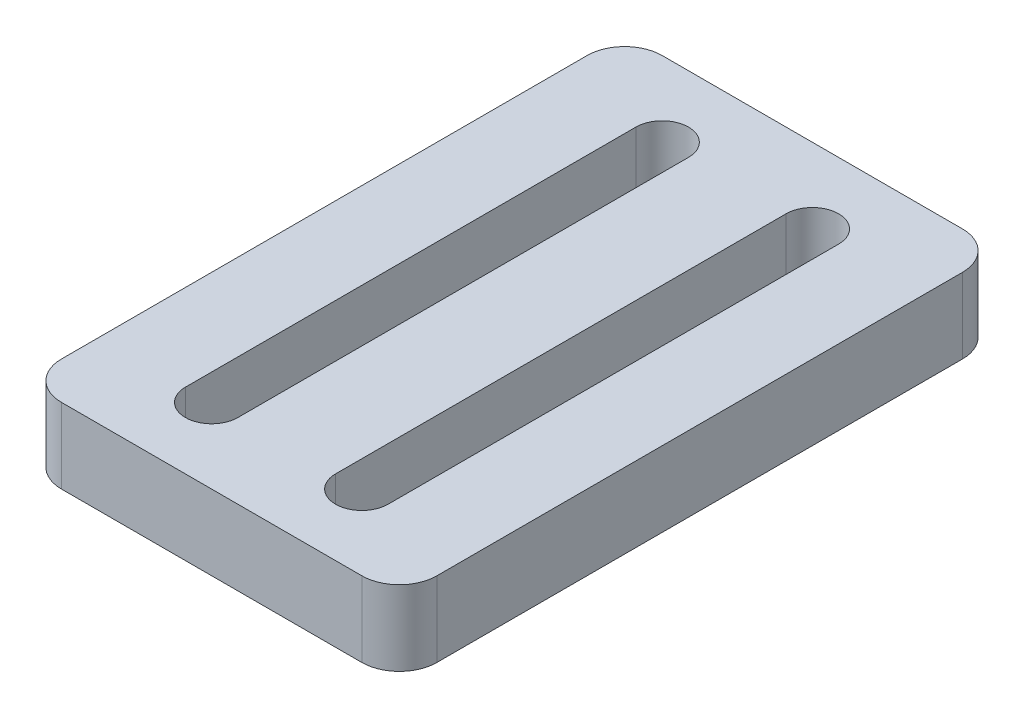
ISO-10303-21;
HEADER;
FILE_DESCRIPTION(('STEP AP214'),'2;1');
FILE_NAME('part.step','',(''),(''),'','','');
FILE_SCHEMA(('AUTOMOTIVE_DESIGN { 1 0 10303 214 1 1 1 1 }'));
ENDSEC;
DATA;
#1=APPLICATION_CONTEXT('core data for automotive mechanical design processes');
#2=APPLICATION_PROTOCOL_DEFINITION('international standard','automotive_design',2000,#1);
#3=PRODUCT_CONTEXT('',#1,'mechanical');
#4=PRODUCT('Part','Part','',(#3));
#5=PRODUCT_RELATED_PRODUCT_CATEGORY('part','',(#4));
#6=PRODUCT_DEFINITION_FORMATION('','',#4);
#7=PRODUCT_DEFINITION_CONTEXT('part definition',#1,'design');
#8=PRODUCT_DEFINITION('design','',#6,#7);
#9=PRODUCT_DEFINITION_SHAPE('','',#8);
#10=(LENGTH_UNIT() NAMED_UNIT(*) SI_UNIT(.MILLI.,.METRE.));
#11=(NAMED_UNIT(*) PLANE_ANGLE_UNIT() SI_UNIT($,.RADIAN.));
#12=(NAMED_UNIT(*) SI_UNIT($,.STERADIAN.) SOLID_ANGLE_UNIT());
#13=UNCERTAINTY_MEASURE_WITH_UNIT(LENGTH_MEASURE(1.E-05),#10,'distance_accuracy_value','');
#14=(GEOMETRIC_REPRESENTATION_CONTEXT(3) GLOBAL_UNCERTAINTY_ASSIGNED_CONTEXT((#13)) GLOBAL_UNIT_ASSIGNED_CONTEXT((#10,
#11,#12)) REPRESENTATION_CONTEXT('',''));
#15=CARTESIAN_POINT('',(0.,0.,0.));
#16=DIRECTION('',(0.,0.,1.));
#17=DIRECTION('',(1.,0.,0.));
#18=AXIS2_PLACEMENT_3D('',#15,#16,#17);
#19=CARTESIAN_POINT('',(12.5,5.,20.));
#20=DIRECTION('',(-1.,0.,0.));
#21=DIRECTION('',(0.,0.,1.));
#22=AXIS2_PLACEMENT_3D('',#19,#20,#21);
#23=PLANE('',#22);
#24=DIRECTION('',(0.,0.,-1.));
#25=VECTOR('',#24,1.);
#26=CARTESIAN_POINT('',(12.5,0.,20.));
#27=LINE('',#26,#25);
#28=CARTESIAN_POINT('',(12.5,0.,17.5));
#29=VERTEX_POINT('',#28);
#30=CARTESIAN_POINT('',(12.5,0.,-17.5));
#31=VERTEX_POINT('',#30);
#32=EDGE_CURVE('E206',#29,#31,#27,.T.);
#33=ORIENTED_EDGE('',*,*,#32,.T.);
#34=DIRECTION('',(0.,-1.,0.));
#35=VECTOR('',#34,1.);
#36=CARTESIAN_POINT('',(12.5,5.,-17.5));
#37=LINE('',#36,#35);
#38=CARTESIAN_POINT('',(12.5,5.,-17.5));
#39=VERTEX_POINT('',#38);
#40=EDGE_CURVE('E302',#31,#39,#37,.F.);
#41=ORIENTED_EDGE('',*,*,#40,.T.);
#42=DIRECTION('',(0.,0.,-1.));
#43=VECTOR('',#42,1.);
#44=CARTESIAN_POINT('',(12.5,5.,20.));
#45=LINE('',#44,#43);
#46=CARTESIAN_POINT('',(12.5,5.,17.5));
#47=VERTEX_POINT('',#46);
#48=EDGE_CURVE('E251',#47,#39,#45,.T.);
#49=ORIENTED_EDGE('',*,*,#48,.F.);
#50=DIRECTION('',(0.,-1.,0.));
#51=VECTOR('',#50,1.);
#52=CARTESIAN_POINT('',(12.5,5.,17.5));
#53=LINE('',#52,#51);
#54=EDGE_CURVE('E298',#47,#29,#53,.T.);
#55=ORIENTED_EDGE('',*,*,#54,.T.);
#56=EDGE_LOOP('',(#33,#41,#49,#55));
#57=FACE_BOUND('',#56,.T.);
#58=ADVANCED_FACE('F43',(#57),#23,.F.);
#59=CARTESIAN_POINT('',(-12.5,5.,-20.));
#60=DIRECTION('',(0.,0.,1.));
#61=DIRECTION('',(1.,0.,0.));
#62=AXIS2_PLACEMENT_3D('',#59,#60,#61);
#63=PLANE('',#62);
#64=DIRECTION('',(-1.,0.,0.));
#65=VECTOR('',#64,1.);
#66=CARTESIAN_POINT('',(-12.5,5.,-20.));
#67=LINE('',#66,#65);
#68=CARTESIAN_POINT('',(10.,5.,-20.));
#69=VERTEX_POINT('',#68);
#70=CARTESIAN_POINT('',(-10.,5.,-20.));
#71=VERTEX_POINT('',#70);
#72=EDGE_CURVE('E255',#69,#71,#67,.T.);
#73=ORIENTED_EDGE('',*,*,#72,.F.);
#74=DIRECTION('',(0.,-1.,0.));
#75=VECTOR('',#74,1.);
#76=CARTESIAN_POINT('',(10.,5.,-20.));
#77=LINE('',#76,#75);
#78=CARTESIAN_POINT('',(10.,0.,-20.));
#79=VERTEX_POINT('',#78);
#80=EDGE_CURVE('E282',#69,#79,#77,.T.);
#81=ORIENTED_EDGE('',*,*,#80,.T.);
#82=DIRECTION('',(-1.,0.,0.));
#83=VECTOR('',#82,1.);
#84=CARTESIAN_POINT('',(-12.5,0.,-20.));
#85=LINE('',#84,#83);
#86=CARTESIAN_POINT('',(-10.,0.,-20.));
#87=VERTEX_POINT('',#86);
#88=EDGE_CURVE('E270',#79,#87,#85,.T.);
#89=ORIENTED_EDGE('',*,*,#88,.T.);
#90=DIRECTION('',(0.,-1.,0.));
#91=VECTOR('',#90,1.);
#92=CARTESIAN_POINT('',(-10.,5.,-20.));
#93=LINE('',#92,#91);
#94=EDGE_CURVE('E266',#87,#71,#93,.F.);
#95=ORIENTED_EDGE('',*,*,#94,.T.);
#96=EDGE_LOOP('',(#73,#81,#89,#95));
#97=FACE_BOUND('',#96,.T.);
#98=ADVANCED_FACE('F346',(#97),#63,.F.);
#99=CARTESIAN_POINT('',(-12.5,5.,20.));
#100=DIRECTION('',(1.,0.,0.));
#101=DIRECTION('',(0.,0.,-1.));
#102=AXIS2_PLACEMENT_3D('',#99,#100,#101);
#103=PLANE('',#102);
#104=DIRECTION('',(0.,0.,1.));
#105=VECTOR('',#104,1.);
#106=CARTESIAN_POINT('',(-12.5,5.,20.));
#107=LINE('',#106,#105);
#108=CARTESIAN_POINT('',(-12.5,5.,-17.5));
#109=VERTEX_POINT('',#108);
#110=CARTESIAN_POINT('',(-12.5,5.,17.5));
#111=VERTEX_POINT('',#110);
#112=EDGE_CURVE('E260',#109,#111,#107,.T.);
#113=ORIENTED_EDGE('',*,*,#112,.F.);
#114=DIRECTION('',(0.,-1.,0.));
#115=VECTOR('',#114,1.);
#116=CARTESIAN_POINT('',(-12.5,5.,-17.5));
#117=LINE('',#116,#115);
#118=CARTESIAN_POINT('',(-12.5,0.,-17.5));
#119=VERTEX_POINT('',#118);
#120=EDGE_CURVE('E319',#109,#119,#117,.T.);
#121=ORIENTED_EDGE('',*,*,#120,.T.);
#122=DIRECTION('',(0.,0.,1.));
#123=VECTOR('',#122,1.);
#124=CARTESIAN_POINT('',(-12.5,0.,20.));
#125=LINE('',#124,#123);
#126=CARTESIAN_POINT('',(-12.5,0.,17.5));
#127=VERTEX_POINT('',#126);
#128=EDGE_CURVE('E274',#119,#127,#125,.T.);
#129=ORIENTED_EDGE('',*,*,#128,.T.);
#130=DIRECTION('',(0.,-1.,0.));
#131=VECTOR('',#130,1.);
#132=CARTESIAN_POINT('',(-12.5,5.,17.5));
#133=LINE('',#132,#131);
#134=EDGE_CURVE('E316',#127,#111,#133,.F.);
#135=ORIENTED_EDGE('',*,*,#134,.T.);
#136=EDGE_LOOP('',(#113,#121,#129,#135));
#137=FACE_BOUND('',#136,.T.);
#138=ADVANCED_FACE('F354',(#137),#103,.F.);
#139=CARTESIAN_POINT('',(-12.5,5.,20.));
#140=DIRECTION('',(0.,0.,-1.));
#141=DIRECTION('',(-1.,0.,0.));
#142=AXIS2_PLACEMENT_3D('',#139,#140,#141);
#143=PLANE('',#142);
#144=DIRECTION('',(1.,0.,0.));
#145=VECTOR('',#144,1.);
#146=CARTESIAN_POINT('',(-12.5,0.,20.));
#147=LINE('',#146,#145);
#148=CARTESIAN_POINT('',(-10.,0.,20.));
#149=VERTEX_POINT('',#148);
#150=CARTESIAN_POINT('',(10.,0.,20.));
#151=VERTEX_POINT('',#150);
#152=EDGE_CURVE('E256',#149,#151,#147,.T.);
#153=ORIENTED_EDGE('',*,*,#152,.T.);
#154=DIRECTION('',(0.,-1.,0.));
#155=VECTOR('',#154,1.);
#156=CARTESIAN_POINT('',(10.,5.,20.));
#157=LINE('',#156,#155);
#158=CARTESIAN_POINT('',(10.,5.,20.));
#159=VERTEX_POINT('',#158);
#160=EDGE_CURVE('E11',#151,#159,#157,.F.);
#161=ORIENTED_EDGE('',*,*,#160,.T.);
#162=DIRECTION('',(1.,0.,0.));
#163=VECTOR('',#162,1.);
#164=CARTESIAN_POINT('',(-12.5,5.,20.));
#165=LINE('',#164,#163);
#166=CARTESIAN_POINT('',(-10.,5.,20.));
#167=VERTEX_POINT('',#166);
#168=EDGE_CURVE('E263',#167,#159,#165,.T.);
#169=ORIENTED_EDGE('',*,*,#168,.F.);
#170=DIRECTION('',(0.,-1.,0.));
#171=VECTOR('',#170,1.);
#172=CARTESIAN_POINT('',(-10.,5.,20.));
#173=LINE('',#172,#171);
#174=EDGE_CURVE('E52',#167,#149,#173,.T.);
#175=ORIENTED_EDGE('',*,*,#174,.T.);
#176=EDGE_LOOP('',(#153,#161,#169,#175));
#177=FACE_BOUND('',#176,.T.);
#178=ADVANCED_FACE('F326',(#177),#143,.F.);
#179=CARTESIAN_POINT('',(0.,5.,0.));
#180=DIRECTION('',(0.,-1.,0.));
#181=DIRECTION('',(0.,0.,-1.));
#182=AXIS2_PLACEMENT_3D('',#179,#180,#181);
#183=PLANE('',#182);
#184=CARTESIAN_POINT('',(-4.99999999999999,5.,15.));
#185=DIRECTION('',(0.,1.,0.));
#186=DIRECTION('',(0.,0.,1.));
#187=AXIS2_PLACEMENT_3D('',#184,#185,#186);
#188=CIRCLE('',#187,1.75000000000001);
#189=CARTESIAN_POINT('',(-6.75,5.,15.));
#190=VERTEX_POINT('',#189);
#191=CARTESIAN_POINT('',(-3.24999999999999,5.,15.));
#192=VERTEX_POINT('',#191);
#193=EDGE_CURVE('E186',#190,#192,#188,.T.);
#194=ORIENTED_EDGE('',*,*,#193,.F.);
#195=DIRECTION('',(0.,0.,1.));
#196=VECTOR('',#195,1.);
#197=CARTESIAN_POINT('',(-6.75,5.,-15.));
#198=LINE('',#197,#196);
#199=CARTESIAN_POINT('',(-6.75,5.,-15.));
#200=VERTEX_POINT('',#199);
#201=EDGE_CURVE('E175',#200,#190,#198,.T.);
#202=ORIENTED_EDGE('',*,*,#201,.F.);
#203=CARTESIAN_POINT('',(-5.,5.,-15.));
#204=DIRECTION('',(0.,1.,0.));
#205=DIRECTION('',(0.,0.,1.));
#206=AXIS2_PLACEMENT_3D('',#203,#204,#205);
#207=CIRCLE('',#206,1.75);
#208=CARTESIAN_POINT('',(-3.25,5.,-15.));
#209=VERTEX_POINT('',#208);
#210=EDGE_CURVE('E190',#209,#200,#207,.T.);
#211=ORIENTED_EDGE('',*,*,#210,.F.);
#212=DIRECTION('',(0.,0.,-1.));
#213=VECTOR('',#212,1.);
#214=CARTESIAN_POINT('',(-3.25,5.,-15.));
#215=LINE('',#214,#213);
#216=EDGE_CURVE('E183',#192,#209,#215,.T.);
#217=ORIENTED_EDGE('',*,*,#216,.F.);
#218=EDGE_LOOP('',(#194,#202,#211,#217));
#219=FACE_BOUND('',#218,.T.);
#220=CARTESIAN_POINT('',(4.99999999999999,5.,15.));
#221=DIRECTION('',(0.,1.,0.));
#222=DIRECTION('',(0.,0.,-1.));
#223=AXIS2_PLACEMENT_3D('',#220,#221,#222);
#224=CIRCLE('',#223,1.75000000000001);
#225=CARTESIAN_POINT('',(3.24999999999999,5.,15.));
#226=VERTEX_POINT('',#225);
#227=CARTESIAN_POINT('',(6.75,5.,15.));
#228=VERTEX_POINT('',#227);
#229=EDGE_CURVE('E245',#226,#228,#224,.T.);
#230=ORIENTED_EDGE('',*,*,#229,.F.);
#231=DIRECTION('',(0.,0.,1.));
#232=VECTOR('',#231,1.);
#233=CARTESIAN_POINT('',(3.25,5.,-15.));
#234=LINE('',#233,#232);
#235=CARTESIAN_POINT('',(3.25,5.,-15.));
#236=VERTEX_POINT('',#235);
#237=EDGE_CURVE('E241',#236,#226,#234,.T.);
#238=ORIENTED_EDGE('',*,*,#237,.F.);
#239=CARTESIAN_POINT('',(5.,5.,-15.));
#240=DIRECTION('',(0.,1.,0.));
#241=DIRECTION('',(0.,0.,-1.));
#242=AXIS2_PLACEMENT_3D('',#239,#240,#241);
#243=CIRCLE('',#242,1.75);
#244=CARTESIAN_POINT('',(6.75,5.,-15.));
#245=VERTEX_POINT('',#244);
#246=EDGE_CURVE('E237',#245,#236,#243,.T.);
#247=ORIENTED_EDGE('',*,*,#246,.F.);
#248=DIRECTION('',(0.,0.,-1.));
#249=VECTOR('',#248,1.);
#250=CARTESIAN_POINT('',(6.75,5.,-15.));
#251=LINE('',#250,#249);
#252=EDGE_CURVE('E236',#228,#245,#251,.T.);
#253=ORIENTED_EDGE('',*,*,#252,.F.);
#254=EDGE_LOOP('',(#230,#238,#247,#253));
#255=FACE_BOUND('',#254,.T.);
#256=ORIENTED_EDGE('',*,*,#48,.T.);
#257=CARTESIAN_POINT('',(10.,5.,-17.5));
#258=DIRECTION('',(0.,-1.,0.));
#259=DIRECTION('',(0.,0.,-1.));
#260=AXIS2_PLACEMENT_3D('',#257,#258,#259);
#261=CIRCLE('',#260,2.5);
#262=EDGE_CURVE('E313',#39,#69,#261,.F.);
#263=ORIENTED_EDGE('',*,*,#262,.T.);
#264=ORIENTED_EDGE('',*,*,#72,.T.);
#265=CARTESIAN_POINT('',(-10.,5.,-17.5));
#266=DIRECTION('',(0.,-1.,0.));
#267=DIRECTION('',(0.,0.,-1.));
#268=AXIS2_PLACEMENT_3D('',#265,#266,#267);
#269=CIRCLE('',#268,2.5);
#270=EDGE_CURVE('E310',#71,#109,#269,.F.);
#271=ORIENTED_EDGE('',*,*,#270,.T.);
#272=ORIENTED_EDGE('',*,*,#112,.T.);
#273=CARTESIAN_POINT('',(-10.,5.,17.5));
#274=DIRECTION('',(0.,-1.,0.));
#275=DIRECTION('',(0.,0.,-1.));
#276=AXIS2_PLACEMENT_3D('',#273,#274,#275);
#277=CIRCLE('',#276,2.5);
#278=EDGE_CURVE('E64',#111,#167,#277,.F.);
#279=ORIENTED_EDGE('',*,*,#278,.T.);
#280=ORIENTED_EDGE('',*,*,#168,.T.);
#281=CARTESIAN_POINT('',(10.,5.,17.5));
#282=DIRECTION('',(0.,-1.,0.));
#283=DIRECTION('',(0.,0.,-1.));
#284=AXIS2_PLACEMENT_3D('',#281,#282,#283);
#285=CIRCLE('',#284,2.5);
#286=EDGE_CURVE('E307',#159,#47,#285,.F.);
#287=ORIENTED_EDGE('',*,*,#286,.T.);
#288=EDGE_LOOP('',(#256,#263,#264,#271,#272,#279,#280,#287));
#289=FACE_BOUND('',#288,.T.);
#290=ADVANCED_FACE('F340',(#219,#255,#289),#183,.F.);
#291=CARTESIAN_POINT('',(0.,0.,0.));
#292=DIRECTION('',(0.,-1.,0.));
#293=DIRECTION('',(0.,0.,-1.));
#294=AXIS2_PLACEMENT_3D('',#291,#292,#293);
#295=PLANE('',#294);
#296=DIRECTION('',(0.,0.,1.));
#297=VECTOR('',#296,1.);
#298=CARTESIAN_POINT('',(-6.75,0.,-15.));
#299=LINE('',#298,#297);
#300=CARTESIAN_POINT('',(-6.75,0.,-15.));
#301=VERTEX_POINT('',#300);
#302=CARTESIAN_POINT('',(-6.75,0.,15.));
#303=VERTEX_POINT('',#302);
#304=EDGE_CURVE('E172',#301,#303,#299,.T.);
#305=ORIENTED_EDGE('',*,*,#304,.T.);
#306=CARTESIAN_POINT('',(-4.99999999999999,0.,15.));
#307=DIRECTION('',(0.,-1.,0.));
#308=DIRECTION('',(0.,0.,-1.));
#309=AXIS2_PLACEMENT_3D('',#306,#307,#308);
#310=CIRCLE('',#309,1.75000000000001);
#311=CARTESIAN_POINT('',(-3.24999999999999,0.,15.));
#312=VERTEX_POINT('',#311);
#313=EDGE_CURVE('E157',#303,#312,#310,.F.);
#314=ORIENTED_EDGE('',*,*,#313,.T.);
#315=DIRECTION('',(0.,0.,-1.));
#316=VECTOR('',#315,1.);
#317=CARTESIAN_POINT('',(-3.25,0.,-15.));
#318=LINE('',#317,#316);
#319=CARTESIAN_POINT('',(-3.25,0.,-15.));
#320=VERTEX_POINT('',#319);
#321=EDGE_CURVE('E196',#312,#320,#318,.T.);
#322=ORIENTED_EDGE('',*,*,#321,.T.);
#323=CARTESIAN_POINT('',(-5.,0.,-15.));
#324=DIRECTION('',(0.,-1.,0.));
#325=DIRECTION('',(0.,0.,-1.));
#326=AXIS2_PLACEMENT_3D('',#323,#324,#325);
#327=CIRCLE('',#326,1.75);
#328=EDGE_CURVE('E181',#320,#301,#327,.F.);
#329=ORIENTED_EDGE('',*,*,#328,.T.);
#330=EDGE_LOOP('',(#305,#314,#322,#329));
#331=FACE_BOUND('',#330,.T.);
#332=DIRECTION('',(0.,0.,1.));
#333=VECTOR('',#332,1.);
#334=CARTESIAN_POINT('',(3.25,0.,-15.));
#335=LINE('',#334,#333);
#336=CARTESIAN_POINT('',(3.25,0.,-15.));
#337=VERTEX_POINT('',#336);
#338=CARTESIAN_POINT('',(3.24999999999999,0.,15.));
#339=VERTEX_POINT('',#338);
#340=EDGE_CURVE('E214',#337,#339,#335,.T.);
#341=ORIENTED_EDGE('',*,*,#340,.T.);
#342=CARTESIAN_POINT('',(4.99999999999999,0.,15.));
#343=DIRECTION('',(0.,-1.,0.));
#344=DIRECTION('',(0.,0.,-1.));
#345=AXIS2_PLACEMENT_3D('',#342,#343,#344);
#346=CIRCLE('',#345,1.75000000000001);
#347=CARTESIAN_POINT('',(6.75,0.,15.));
#348=VERTEX_POINT('',#347);
#349=EDGE_CURVE('E215',#339,#348,#346,.F.);
#350=ORIENTED_EDGE('',*,*,#349,.T.);
#351=DIRECTION('',(0.,0.,-1.));
#352=VECTOR('',#351,1.);
#353=CARTESIAN_POINT('',(6.75,0.,-15.));
#354=LINE('',#353,#352);
#355=CARTESIAN_POINT('',(6.75,0.,-15.));
#356=VERTEX_POINT('',#355);
#357=EDGE_CURVE('E219',#348,#356,#354,.T.);
#358=ORIENTED_EDGE('',*,*,#357,.T.);
#359=CARTESIAN_POINT('',(5.,0.,-15.));
#360=DIRECTION('',(0.,-1.,0.));
#361=DIRECTION('',(0.,0.,-1.));
#362=AXIS2_PLACEMENT_3D('',#359,#360,#361);
#363=CIRCLE('',#362,1.75);
#364=EDGE_CURVE('E210',#356,#337,#363,.F.);
#365=ORIENTED_EDGE('',*,*,#364,.T.);
#366=EDGE_LOOP('',(#341,#350,#358,#365));
#367=FACE_BOUND('',#366,.T.);
#368=ORIENTED_EDGE('',*,*,#88,.F.);
#369=CARTESIAN_POINT('',(10.,0.,-17.5));
#370=DIRECTION('',(0.,-1.,0.));
#371=DIRECTION('',(0.,0.,-1.));
#372=AXIS2_PLACEMENT_3D('',#369,#370,#371);
#373=CIRCLE('',#372,2.5);
#374=EDGE_CURVE('E295',#79,#31,#373,.T.);
#375=ORIENTED_EDGE('',*,*,#374,.T.);
#376=ORIENTED_EDGE('',*,*,#32,.F.);
#377=CARTESIAN_POINT('',(10.,0.,17.5));
#378=DIRECTION('',(0.,-1.,0.));
#379=DIRECTION('',(0.,0.,-1.));
#380=AXIS2_PLACEMENT_3D('',#377,#378,#379);
#381=CIRCLE('',#380,2.5);
#382=EDGE_CURVE('E289',#29,#151,#381,.T.);
#383=ORIENTED_EDGE('',*,*,#382,.T.);
#384=ORIENTED_EDGE('',*,*,#152,.F.);
#385=CARTESIAN_POINT('',(-10.,0.,17.5));
#386=DIRECTION('',(0.,-1.,0.));
#387=DIRECTION('',(0.,0.,-1.));
#388=AXIS2_PLACEMENT_3D('',#385,#386,#387);
#389=CIRCLE('',#388,2.5);
#390=EDGE_CURVE('E286',#149,#127,#389,.T.);
#391=ORIENTED_EDGE('',*,*,#390,.T.);
#392=ORIENTED_EDGE('',*,*,#128,.F.);
#393=CARTESIAN_POINT('',(-10.,0.,-17.5));
#394=DIRECTION('',(0.,-1.,0.));
#395=DIRECTION('',(0.,0.,-1.));
#396=AXIS2_PLACEMENT_3D('',#393,#394,#395);
#397=CIRCLE('',#396,2.5);
#398=EDGE_CURVE('E292',#119,#87,#397,.T.);
#399=ORIENTED_EDGE('',*,*,#398,.T.);
#400=EDGE_LOOP('',(#368,#375,#376,#383,#384,#391,#392,#399));
#401=FACE_BOUND('',#400,.T.);
#402=ADVANCED_FACE('F179',(#331,#367,#401),#295,.T.);
#403=CARTESIAN_POINT('',(3.25,-33.6823395861986,-15.));
#404=DIRECTION('',(-1.,0.,0.));
#405=DIRECTION('',(0.,0.,1.));
#406=AXIS2_PLACEMENT_3D('',#403,#404,#405);
#407=PLANE('',#406);
#408=DIRECTION('',(0.,1.,0.));
#409=VECTOR('',#408,1.);
#410=CARTESIAN_POINT('',(3.25,-33.6823395861986,-15.));
#411=LINE('',#410,#409);
#412=EDGE_CURVE('E207',#337,#236,#411,.T.);
#413=ORIENTED_EDGE('',*,*,#412,.T.);
#414=ORIENTED_EDGE('',*,*,#237,.T.);
#415=DIRECTION('',(0.,1.,0.));
#416=VECTOR('',#415,1.);
#417=CARTESIAN_POINT('',(3.24999999999999,-33.6823395861986,15.));
#418=LINE('',#417,#416);
#419=EDGE_CURVE('E211',#339,#226,#418,.T.);
#420=ORIENTED_EDGE('',*,*,#419,.F.);
#421=ORIENTED_EDGE('',*,*,#340,.F.);
#422=EDGE_LOOP('',(#413,#414,#420,#421));
#423=FACE_BOUND('',#422,.T.);
#424=ADVANCED_FACE('F462',(#423),#407,.F.);
#425=CARTESIAN_POINT('',(4.99999999999999,-33.6823395861986,15.));
#426=DIRECTION('',(0.,1.,0.));
#427=DIRECTION('',(0.,0.,1.));
#428=AXIS2_PLACEMENT_3D('',#425,#426,#427);
#429=CYLINDRICAL_SURFACE('',#428,1.75000000000001);
#430=ORIENTED_EDGE('',*,*,#419,.T.);
#431=ORIENTED_EDGE('',*,*,#229,.T.);
#432=DIRECTION('',(0.,1.,0.));
#433=VECTOR('',#432,1.);
#434=CARTESIAN_POINT('',(6.75,-33.6823395861986,15.));
#435=LINE('',#434,#433);
#436=EDGE_CURVE('E216',#348,#228,#435,.T.);
#437=ORIENTED_EDGE('',*,*,#436,.F.);
#438=ORIENTED_EDGE('',*,*,#349,.F.);
#439=EDGE_LOOP('',(#430,#431,#437,#438));
#440=FACE_BOUND('',#439,.T.);
#441=ADVANCED_FACE('F452',(#440),#429,.F.);
#442=CARTESIAN_POINT('',(6.75,-33.6823395861986,-15.));
#443=DIRECTION('',(1.,0.,0.));
#444=DIRECTION('',(0.,0.,-1.));
#445=AXIS2_PLACEMENT_3D('',#442,#443,#444);
#446=PLANE('',#445);
#447=ORIENTED_EDGE('',*,*,#436,.T.);
#448=ORIENTED_EDGE('',*,*,#252,.T.);
#449=DIRECTION('',(0.,1.,0.));
#450=VECTOR('',#449,1.);
#451=CARTESIAN_POINT('',(6.75,-33.6823395861986,-15.));
#452=LINE('',#451,#450);
#453=EDGE_CURVE('E220',#356,#245,#452,.T.);
#454=ORIENTED_EDGE('',*,*,#453,.F.);
#455=ORIENTED_EDGE('',*,*,#357,.F.);
#456=EDGE_LOOP('',(#447,#448,#454,#455));
#457=FACE_BOUND('',#456,.T.);
#458=ADVANCED_FACE('F442',(#457),#446,.F.);
#459=CARTESIAN_POINT('',(5.,-33.6823395861986,-15.));
#460=DIRECTION('',(0.,1.,0.));
#461=DIRECTION('',(0.,0.,1.));
#462=AXIS2_PLACEMENT_3D('',#459,#460,#461);
#463=CYLINDRICAL_SURFACE('',#462,1.75);
#464=ORIENTED_EDGE('',*,*,#453,.T.);
#465=ORIENTED_EDGE('',*,*,#246,.T.);
#466=ORIENTED_EDGE('',*,*,#412,.F.);
#467=ORIENTED_EDGE('',*,*,#364,.F.);
#468=EDGE_LOOP('',(#464,#465,#466,#467));
#469=FACE_BOUND('',#468,.T.);
#470=ADVANCED_FACE('F433',(#469),#463,.F.);
#471=CARTESIAN_POINT('',(-6.75,-33.6823395861986,-15.));
#472=DIRECTION('',(-1.,0.,0.));
#473=DIRECTION('',(0.,0.,1.));
#474=AXIS2_PLACEMENT_3D('',#471,#472,#473);
#475=PLANE('',#474);
#476=DIRECTION('',(0.,1.,0.));
#477=VECTOR('',#476,1.);
#478=CARTESIAN_POINT('',(-6.75,-33.6823395861986,-15.));
#479=LINE('',#478,#477);
#480=EDGE_CURVE('E194',#301,#200,#479,.T.);
#481=ORIENTED_EDGE('',*,*,#480,.T.);
#482=ORIENTED_EDGE('',*,*,#201,.T.);
#483=DIRECTION('',(0.,1.,0.));
#484=VECTOR('',#483,1.);
#485=CARTESIAN_POINT('',(-6.75,-33.6823395861986,15.));
#486=LINE('',#485,#484);
#487=EDGE_CURVE('E161',#303,#190,#486,.T.);
#488=ORIENTED_EDGE('',*,*,#487,.F.);
#489=ORIENTED_EDGE('',*,*,#304,.F.);
#490=EDGE_LOOP('',(#481,#482,#488,#489));
#491=FACE_BOUND('',#490,.T.);
#492=ADVANCED_FACE('F171',(#491),#475,.F.);
#493=CARTESIAN_POINT('',(-4.99999999999999,-33.6823395861986,15.));
#494=DIRECTION('',(0.,1.,0.));
#495=DIRECTION('',(0.,0.,1.));
#496=AXIS2_PLACEMENT_3D('',#493,#494,#495);
#497=CYLINDRICAL_SURFACE('',#496,1.75000000000001);
#498=ORIENTED_EDGE('',*,*,#487,.T.);
#499=ORIENTED_EDGE('',*,*,#193,.T.);
#500=DIRECTION('',(0.,1.,0.));
#501=VECTOR('',#500,1.);
#502=CARTESIAN_POINT('',(-3.24999999999999,-33.6823395861986,15.));
#503=LINE('',#502,#501);
#504=EDGE_CURVE('E163',#312,#192,#503,.T.);
#505=ORIENTED_EDGE('',*,*,#504,.F.);
#506=ORIENTED_EDGE('',*,*,#313,.F.);
#507=EDGE_LOOP('',(#498,#499,#505,#506));
#508=FACE_BOUND('',#507,.T.);
#509=ADVANCED_FACE('F159',(#508),#497,.F.);
#510=CARTESIAN_POINT('',(-3.25,-33.6823395861986,-15.));
#511=DIRECTION('',(1.,0.,0.));
#512=DIRECTION('',(0.,0.,-1.));
#513=AXIS2_PLACEMENT_3D('',#510,#511,#512);
#514=PLANE('',#513);
#515=ORIENTED_EDGE('',*,*,#504,.T.);
#516=ORIENTED_EDGE('',*,*,#216,.T.);
#517=DIRECTION('',(0.,1.,0.));
#518=VECTOR('',#517,1.);
#519=CARTESIAN_POINT('',(-3.25,-33.6823395861986,-15.));
#520=LINE('',#519,#518);
#521=EDGE_CURVE('E195',#320,#209,#520,.T.);
#522=ORIENTED_EDGE('',*,*,#521,.F.);
#523=ORIENTED_EDGE('',*,*,#321,.F.);
#524=EDGE_LOOP('',(#515,#516,#522,#523));
#525=FACE_BOUND('',#524,.T.);
#526=ADVANCED_FACE('F406',(#525),#514,.F.);
#527=CARTESIAN_POINT('',(-5.,-33.6823395861986,-15.));
#528=DIRECTION('',(0.,1.,0.));
#529=DIRECTION('',(0.,0.,1.));
#530=AXIS2_PLACEMENT_3D('',#527,#528,#529);
#531=CYLINDRICAL_SURFACE('',#530,1.75);
#532=ORIENTED_EDGE('',*,*,#521,.T.);
#533=ORIENTED_EDGE('',*,*,#210,.T.);
#534=ORIENTED_EDGE('',*,*,#480,.F.);
#535=ORIENTED_EDGE('',*,*,#328,.F.);
#536=EDGE_LOOP('',(#532,#533,#534,#535));
#537=FACE_BOUND('',#536,.T.);
#538=ADVANCED_FACE('F370',(#537),#531,.F.);
#539=CARTESIAN_POINT('',(10.,5.,-17.5));
#540=DIRECTION('',(0.,-1.,0.));
#541=DIRECTION('',(0.,0.,-1.));
#542=AXIS2_PLACEMENT_3D('',#539,#540,#541);
#543=CYLINDRICAL_SURFACE('',#542,2.5);
#544=ORIENTED_EDGE('',*,*,#262,.F.);
#545=ORIENTED_EDGE('',*,*,#40,.F.);
#546=ORIENTED_EDGE('',*,*,#374,.F.);
#547=ORIENTED_EDGE('',*,*,#80,.F.);
#548=EDGE_LOOP('',(#544,#545,#546,#547));
#549=FACE_BOUND('',#548,.T.);
#550=ADVANCED_FACE('F344',(#549),#543,.T.);
#551=CARTESIAN_POINT('',(-10.,5.,-17.5));
#552=DIRECTION('',(0.,-1.,0.));
#553=DIRECTION('',(0.,0.,-1.));
#554=AXIS2_PLACEMENT_3D('',#551,#552,#553);
#555=CYLINDRICAL_SURFACE('',#554,2.5);
#556=ORIENTED_EDGE('',*,*,#270,.F.);
#557=ORIENTED_EDGE('',*,*,#94,.F.);
#558=ORIENTED_EDGE('',*,*,#398,.F.);
#559=ORIENTED_EDGE('',*,*,#120,.F.);
#560=EDGE_LOOP('',(#556,#557,#558,#559));
#561=FACE_BOUND('',#560,.T.);
#562=ADVANCED_FACE('F351',(#561),#555,.T.);
#563=CARTESIAN_POINT('',(10.,5.,17.5));
#564=DIRECTION('',(0.,-1.,0.));
#565=DIRECTION('',(0.,0.,-1.));
#566=AXIS2_PLACEMENT_3D('',#563,#564,#565);
#567=CYLINDRICAL_SURFACE('',#566,2.5);
#568=ORIENTED_EDGE('',*,*,#286,.F.);
#569=ORIENTED_EDGE('',*,*,#160,.F.);
#570=ORIENTED_EDGE('',*,*,#382,.F.);
#571=ORIENTED_EDGE('',*,*,#54,.F.);
#572=EDGE_LOOP('',(#568,#569,#570,#571));
#573=FACE_BOUND('',#572,.T.);
#574=ADVANCED_FACE('F335',(#573),#567,.T.);
#575=CARTESIAN_POINT('',(-10.,5.,17.5));
#576=DIRECTION('',(0.,-1.,0.));
#577=DIRECTION('',(0.,0.,-1.));
#578=AXIS2_PLACEMENT_3D('',#575,#576,#577);
#579=CYLINDRICAL_SURFACE('',#578,2.5);
#580=ORIENTED_EDGE('',*,*,#278,.F.);
#581=ORIENTED_EDGE('',*,*,#134,.F.);
#582=ORIENTED_EDGE('',*,*,#390,.F.);
#583=ORIENTED_EDGE('',*,*,#174,.F.);
#584=EDGE_LOOP('',(#580,#581,#582,#583));
#585=FACE_BOUND('',#584,.T.);
#586=ADVANCED_FACE('F45',(#585),#579,.T.);
#587=CLOSED_SHELL('',(#58,#98,#138,#178,#290,#402,#424,#441,#458,#470,#492,#509,#526,#538,#550,
#562,#574,#586));
#588=MANIFOLD_SOLID_BREP('B2',#587);
#589=ADVANCED_BREP_SHAPE_REPRESENTATION('',(#18,#588),#14);
#590=SHAPE_DEFINITION_REPRESENTATION(#9,#589);
ENDSEC;
END-ISO-10303-21;
